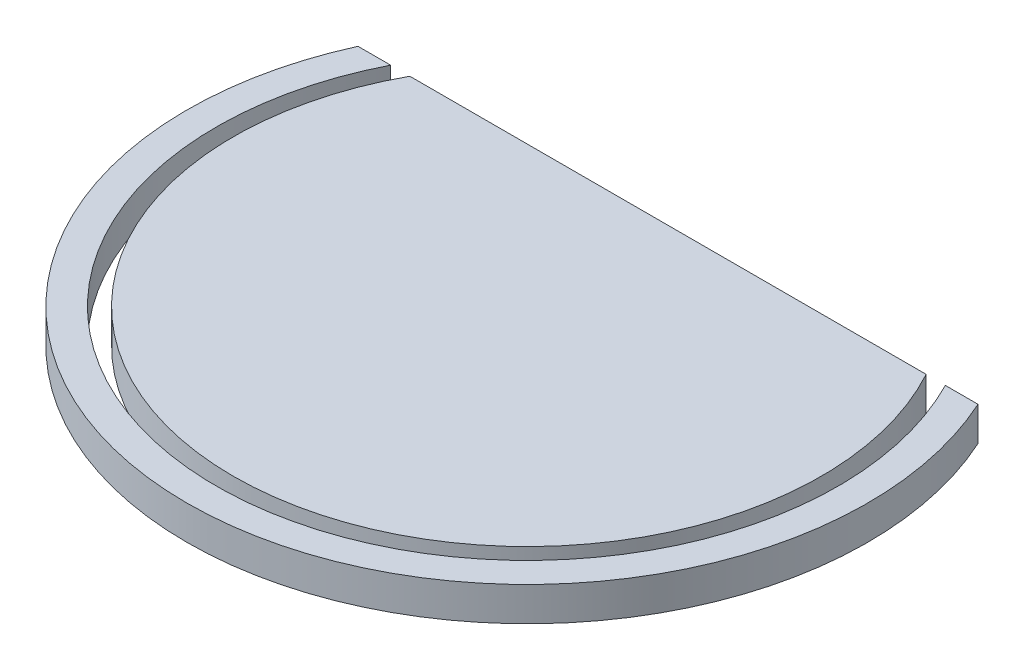
ISO-10303-21;
HEADER;
FILE_DESCRIPTION(('STEP AP214'),'2;1');
FILE_NAME('part.step','',(''),(''),'','','');
FILE_SCHEMA(('AUTOMOTIVE_DESIGN { 1 0 10303 214 1 1 1 1 }'));
ENDSEC;
DATA;
#1=APPLICATION_CONTEXT('core data for automotive mechanical design processes');
#2=APPLICATION_PROTOCOL_DEFINITION('international standard','automotive_design',2000,#1);
#3=PRODUCT_CONTEXT('',#1,'mechanical');
#4=PRODUCT('Part','Part','',(#3));
#5=PRODUCT_RELATED_PRODUCT_CATEGORY('part','',(#4));
#6=PRODUCT_DEFINITION_FORMATION('','',#4);
#7=PRODUCT_DEFINITION_CONTEXT('part definition',#1,'design');
#8=PRODUCT_DEFINITION('design','',#6,#7);
#9=PRODUCT_DEFINITION_SHAPE('','',#8);
#10=(LENGTH_UNIT() NAMED_UNIT(*) SI_UNIT(.MILLI.,.METRE.));
#11=(NAMED_UNIT(*) PLANE_ANGLE_UNIT() SI_UNIT($,.RADIAN.));
#12=(NAMED_UNIT(*) SI_UNIT($,.STERADIAN.) SOLID_ANGLE_UNIT());
#13=UNCERTAINTY_MEASURE_WITH_UNIT(LENGTH_MEASURE(1.E-05),#10,'distance_accuracy_value','');
#14=(GEOMETRIC_REPRESENTATION_CONTEXT(3) GLOBAL_UNCERTAINTY_ASSIGNED_CONTEXT((#13)) GLOBAL_UNIT_ASSIGNED_CONTEXT((#10,
#11,#12)) REPRESENTATION_CONTEXT('',''));
#15=CARTESIAN_POINT('',(0.,0.,0.));
#16=DIRECTION('',(0.,0.,1.));
#17=DIRECTION('',(1.,0.,0.));
#18=AXIS2_PLACEMENT_3D('',#15,#16,#17);
#19=CARTESIAN_POINT('',(0.,10.,0.));
#20=DIRECTION('',(0.,-1.,0.));
#21=DIRECTION('',(0.,0.,-1.));
#22=AXIS2_PLACEMENT_3D('',#19,#20,#21);
#23=CYLINDRICAL_SURFACE('',#22,91.3599666376949);
#24=CARTESIAN_POINT('',(0.,0.,0.));
#25=DIRECTION('',(0.,1.,0.));
#26=DIRECTION('',(0.,0.,1.));
#27=AXIS2_PLACEMENT_3D('',#24,#25,#26);
#28=CIRCLE('',#27,91.3599666376949);
#29=CARTESIAN_POINT('',(-81.4772122603697,0.,-41.3292558161818));
#30=VERTEX_POINT('',#29);
#31=CARTESIAN_POINT('',(81.4772122603697,0.,-41.3292558161818));
#32=VERTEX_POINT('',#31);
#33=EDGE_CURVE('E128',#30,#32,#28,.T.);
#34=ORIENTED_EDGE('',*,*,#33,.F.);
#35=DIRECTION('',(0.,-1.,0.));
#36=VECTOR('',#35,1.);
#37=CARTESIAN_POINT('',(-81.4772122603697,10.,-41.3292558161818));
#38=LINE('',#37,#36);
#39=CARTESIAN_POINT('',(-81.4772122603697,10.,-41.3292558161818));
#40=VERTEX_POINT('',#39);
#41=EDGE_CURVE('E13',#40,#30,#38,.T.);
#42=ORIENTED_EDGE('',*,*,#41,.F.);
#43=CARTESIAN_POINT('',(0.,10.,0.));
#44=DIRECTION('',(0.,1.,0.));
#45=DIRECTION('',(0.,0.,1.));
#46=AXIS2_PLACEMENT_3D('',#43,#44,#45);
#47=CIRCLE('',#46,91.3599666376949);
#48=CARTESIAN_POINT('',(81.4772122603697,10.,-41.3292558161818));
#49=VERTEX_POINT('',#48);
#50=EDGE_CURVE('E117',#40,#49,#47,.T.);
#51=ORIENTED_EDGE('',*,*,#50,.T.);
#52=DIRECTION('',(0.,-1.,0.));
#53=VECTOR('',#52,1.);
#54=CARTESIAN_POINT('',(81.4772122603697,10.,-41.3292558161818));
#55=LINE('',#54,#53);
#56=EDGE_CURVE('E106',#49,#32,#55,.T.);
#57=ORIENTED_EDGE('',*,*,#56,.T.);
#58=EDGE_LOOP('',(#34,#42,#51,#57));
#59=FACE_BOUND('',#58,.T.);
#60=ADVANCED_FACE('F67',(#59),#23,.F.);
#61=CARTESIAN_POINT('',(0.,10.,-41.3292558161818));
#62=DIRECTION('',(0.,0.,1.));
#63=DIRECTION('',(1.,0.,0.));
#64=AXIS2_PLACEMENT_3D('',#61,#62,#63);
#65=PLANE('',#64);
#66=DIRECTION('',(-1.,0.,0.));
#67=VECTOR('',#66,1.);
#68=CARTESIAN_POINT('',(0.,0.,-41.3292558161818));
#69=LINE('',#68,#67);
#70=CARTESIAN_POINT('',(-91.0598298575206,0.,-41.3292558161818));
#71=VERTEX_POINT('',#70);
#72=EDGE_CURVE('E122',#30,#71,#69,.T.);
#73=ORIENTED_EDGE('',*,*,#72,.T.);
#74=DIRECTION('',(0.,-1.,0.));
#75=VECTOR('',#74,1.);
#76=CARTESIAN_POINT('',(-91.0598298575206,10.,-41.3292558161818));
#77=LINE('',#76,#75);
#78=CARTESIAN_POINT('',(-91.0598298575206,10.,-41.3292558161818));
#79=VERTEX_POINT('',#78);
#80=EDGE_CURVE('E75',#79,#71,#77,.T.);
#81=ORIENTED_EDGE('',*,*,#80,.F.);
#82=DIRECTION('',(-1.,0.,0.));
#83=VECTOR('',#82,1.);
#84=CARTESIAN_POINT('',(0.,10.,-41.3292558161818));
#85=LINE('',#84,#83);
#86=EDGE_CURVE('E112',#40,#79,#85,.T.);
#87=ORIENTED_EDGE('',*,*,#86,.F.);
#88=ORIENTED_EDGE('',*,*,#41,.T.);
#89=EDGE_LOOP('',(#73,#81,#87,#88));
#90=FACE_BOUND('',#89,.T.);
#91=ADVANCED_FACE('F120',(#90),#65,.F.);
#92=CARTESIAN_POINT('',(0.,10.,0.));
#93=DIRECTION('',(0.,-1.,0.));
#94=DIRECTION('',(0.,0.,-1.));
#95=AXIS2_PLACEMENT_3D('',#92,#93,#94);
#96=CYLINDRICAL_SURFACE('',#95,100.);
#97=CARTESIAN_POINT('',(0.,0.,0.));
#98=DIRECTION('',(0.,1.,0.));
#99=DIRECTION('',(0.,0.,1.));
#100=AXIS2_PLACEMENT_3D('',#97,#98,#99);
#101=CIRCLE('',#100,100.);
#102=CARTESIAN_POINT('',(91.0598298575206,0.,-41.3292558161818));
#103=VERTEX_POINT('',#102);
#104=EDGE_CURVE('E99',#71,#103,#101,.T.);
#105=ORIENTED_EDGE('',*,*,#104,.T.);
#106=DIRECTION('',(0.,-1.,0.));
#107=VECTOR('',#106,1.);
#108=CARTESIAN_POINT('',(91.0598298575206,10.,-41.3292558161818));
#109=LINE('',#108,#107);
#110=CARTESIAN_POINT('',(91.0598298575206,10.,-41.3292558161818));
#111=VERTEX_POINT('',#110);
#112=EDGE_CURVE('E123',#111,#103,#109,.T.);
#113=ORIENTED_EDGE('',*,*,#112,.F.);
#114=CARTESIAN_POINT('',(0.,10.,0.));
#115=DIRECTION('',(0.,1.,0.));
#116=DIRECTION('',(0.,0.,1.));
#117=AXIS2_PLACEMENT_3D('',#114,#115,#116);
#118=CIRCLE('',#117,100.);
#119=EDGE_CURVE('E116',#79,#111,#118,.T.);
#120=ORIENTED_EDGE('',*,*,#119,.F.);
#121=ORIENTED_EDGE('',*,*,#80,.T.);
#122=EDGE_LOOP('',(#105,#113,#120,#121));
#123=FACE_BOUND('',#122,.T.);
#124=ADVANCED_FACE('F124',(#123),#96,.T.);
#125=EDGE_CURVE('E132',#103,#32,#69,.T.);
#126=ORIENTED_EDGE('',*,*,#125,.T.);
#127=ORIENTED_EDGE('',*,*,#56,.F.);
#128=EDGE_CURVE('E83',#111,#49,#85,.T.);
#129=ORIENTED_EDGE('',*,*,#128,.F.);
#130=ORIENTED_EDGE('',*,*,#112,.T.);
#131=EDGE_LOOP('',(#126,#127,#129,#130));
#132=FACE_BOUND('',#131,.T.);
#133=ADVANCED_FACE('F137',(#132),#65,.F.);
#134=CARTESIAN_POINT('',(0.,10.,0.));
#135=DIRECTION('',(0.,1.,0.));
#136=DIRECTION('',(0.,0.,1.));
#137=AXIS2_PLACEMENT_3D('',#134,#135,#136);
#138=PLANE('',#137);
#139=ORIENTED_EDGE('',*,*,#50,.F.);
#140=ORIENTED_EDGE('',*,*,#86,.T.);
#141=ORIENTED_EDGE('',*,*,#119,.T.);
#142=ORIENTED_EDGE('',*,*,#128,.T.);
#143=EDGE_LOOP('',(#139,#140,#141,#142));
#144=FACE_BOUND('',#143,.T.);
#145=ADVANCED_FACE('F114',(#144),#138,.T.);
#146=CARTESIAN_POINT('',(0.,0.,0.));
#147=DIRECTION('',(0.,1.,0.));
#148=DIRECTION('',(0.,0.,1.));
#149=AXIS2_PLACEMENT_3D('',#146,#147,#148);
#150=PLANE('',#149);
#151=ORIENTED_EDGE('',*,*,#33,.T.);
#152=ORIENTED_EDGE('',*,*,#125,.F.);
#153=ORIENTED_EDGE('',*,*,#104,.F.);
#154=ORIENTED_EDGE('',*,*,#72,.F.);
#155=EDGE_LOOP('',(#151,#152,#153,#154));
#156=FACE_BOUND('',#155,.T.);
#157=ADVANCED_FACE('F139',(#156),#150,.F.);
#158=CLOSED_SHELL('',(#60,#91,#124,#133,#145,#157));
#159=MANIFOLD_SOLID_BREP('B2',#158);
#160=CARTESIAN_POINT('',(0.,10.,-41.3292558161818));
#161=DIRECTION('',(0.,0.,1.));
#162=DIRECTION('',(1.,0.,0.));
#163=AXIS2_PLACEMENT_3D('',#160,#161,#162);
#164=PLANE('',#163);
#165=DIRECTION('',(-1.,0.,0.));
#166=VECTOR('',#165,1.);
#167=CARTESIAN_POINT('',(0.,0.,-41.3292558161818));
#168=LINE('',#167,#166);
#169=CARTESIAN_POINT('',(75.8283354119315,0.,-41.3292558161818));
#170=VERTEX_POINT('',#169);
#171=CARTESIAN_POINT('',(-75.8283354119315,0.,-41.3292558161818));
#172=VERTEX_POINT('',#171);
#173=EDGE_CURVE('E221',#170,#172,#168,.T.);
#174=ORIENTED_EDGE('',*,*,#173,.T.);
#175=DIRECTION('',(0.,-1.,0.));
#176=VECTOR('',#175,1.);
#177=CARTESIAN_POINT('',(-75.8283354119315,10.,-41.3292558161818));
#178=LINE('',#177,#176);
#179=CARTESIAN_POINT('',(-75.8283354119315,10.,-41.3292558161818));
#180=VERTEX_POINT('',#179);
#181=EDGE_CURVE('E65',#180,#172,#178,.T.);
#182=ORIENTED_EDGE('',*,*,#181,.F.);
#183=DIRECTION('',(-1.,0.,0.));
#184=VECTOR('',#183,1.);
#185=CARTESIAN_POINT('',(0.,10.,-41.3292558161818));
#186=LINE('',#185,#184);
#187=CARTESIAN_POINT('',(75.8283354119315,10.,-41.3292558161818));
#188=VERTEX_POINT('',#187);
#189=EDGE_CURVE('E220',#188,#180,#186,.T.);
#190=ORIENTED_EDGE('',*,*,#189,.F.);
#191=DIRECTION('',(0.,-1.,0.));
#192=VECTOR('',#191,1.);
#193=CARTESIAN_POINT('',(75.8283354119315,10.,-41.3292558161818));
#194=LINE('',#193,#192);
#195=EDGE_CURVE('E197',#188,#170,#194,.T.);
#196=ORIENTED_EDGE('',*,*,#195,.T.);
#197=EDGE_LOOP('',(#174,#182,#190,#196));
#198=FACE_BOUND('',#197,.T.);
#199=ADVANCED_FACE('F188',(#198),#164,.F.);
#200=CARTESIAN_POINT('',(0.,10.,0.));
#201=DIRECTION('',(0.,-1.,0.));
#202=DIRECTION('',(0.,0.,-1.));
#203=AXIS2_PLACEMENT_3D('',#200,#201,#202);
#204=CYLINDRICAL_SURFACE('',#203,86.3599666376949);
#205=CARTESIAN_POINT('',(0.,0.,0.));
#206=DIRECTION('',(0.,1.,0.));
#207=DIRECTION('',(0.,0.,1.));
#208=AXIS2_PLACEMENT_3D('',#205,#206,#207);
#209=CIRCLE('',#208,86.3599666376949);
#210=EDGE_CURVE('E212',#172,#170,#209,.T.);
#211=ORIENTED_EDGE('',*,*,#210,.T.);
#212=ORIENTED_EDGE('',*,*,#195,.F.);
#213=CARTESIAN_POINT('',(0.,10.,0.));
#214=DIRECTION('',(0.,1.,0.));
#215=DIRECTION('',(0.,0.,1.));
#216=AXIS2_PLACEMENT_3D('',#213,#214,#215);
#217=CIRCLE('',#216,86.3599666376949);
#218=EDGE_CURVE('E204',#180,#188,#217,.T.);
#219=ORIENTED_EDGE('',*,*,#218,.F.);
#220=ORIENTED_EDGE('',*,*,#181,.T.);
#221=EDGE_LOOP('',(#211,#212,#219,#220));
#222=FACE_BOUND('',#221,.T.);
#223=ADVANCED_FACE('F215',(#222),#204,.T.);
#224=CARTESIAN_POINT('',(0.,10.,0.));
#225=DIRECTION('',(0.,1.,0.));
#226=DIRECTION('',(0.,0.,1.));
#227=AXIS2_PLACEMENT_3D('',#224,#225,#226);
#228=PLANE('',#227);
#229=ORIENTED_EDGE('',*,*,#189,.T.);
#230=ORIENTED_EDGE('',*,*,#218,.T.);
#231=EDGE_LOOP('',(#229,#230));
#232=FACE_BOUND('',#231,.T.);
#233=ADVANCED_FACE('F232',(#232),#228,.T.);
#234=CARTESIAN_POINT('',(0.,0.,0.));
#235=DIRECTION('',(0.,1.,0.));
#236=DIRECTION('',(0.,0.,1.));
#237=AXIS2_PLACEMENT_3D('',#234,#235,#236);
#238=PLANE('',#237);
#239=ORIENTED_EDGE('',*,*,#173,.F.);
#240=ORIENTED_EDGE('',*,*,#210,.F.);
#241=EDGE_LOOP('',(#239,#240));
#242=FACE_BOUND('',#241,.T.);
#243=ADVANCED_FACE('F225',(#242),#238,.F.);
#244=CLOSED_SHELL('',(#199,#223,#233,#243));
#245=MANIFOLD_SOLID_BREP('B7',#244);
#246=ADVANCED_BREP_SHAPE_REPRESENTATION('',(#18,#159,#245),#14);
#247=SHAPE_DEFINITION_REPRESENTATION(#9,#246);
ENDSEC;
END-ISO-10303-21;
